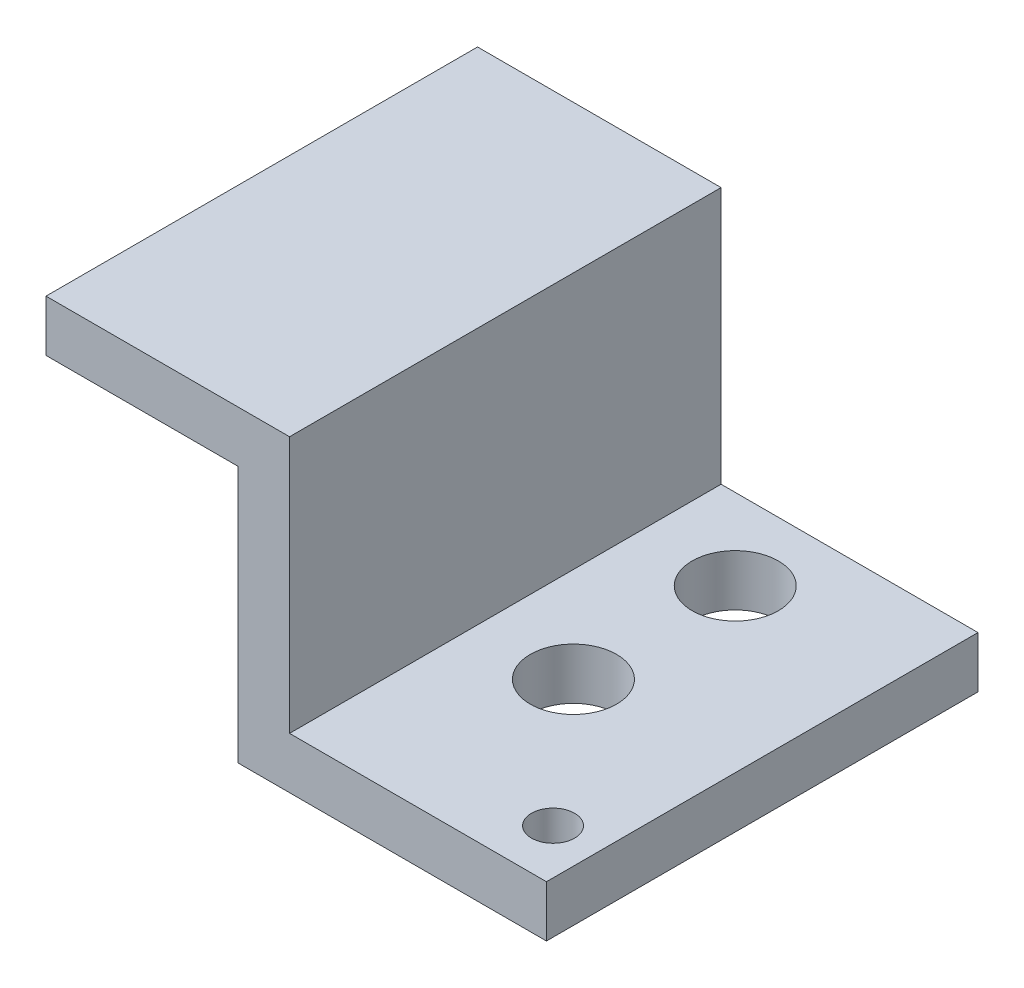
ISO-10303-21;
HEADER;
FILE_DESCRIPTION(('STEP AP214'),'2;1');
FILE_NAME('part.step','',(''),(''),'','','');
FILE_SCHEMA(('AUTOMOTIVE_DESIGN { 1 0 10303 214 1 1 1 1 }'));
ENDSEC;
DATA;
#1=APPLICATION_CONTEXT('core data for automotive mechanical design processes');
#2=APPLICATION_PROTOCOL_DEFINITION('international standard','automotive_design',2000,#1);
#3=PRODUCT_CONTEXT('',#1,'mechanical');
#4=PRODUCT('Part','Part','',(#3));
#5=PRODUCT_RELATED_PRODUCT_CATEGORY('part','',(#4));
#6=PRODUCT_DEFINITION_FORMATION('','',#4);
#7=PRODUCT_DEFINITION_CONTEXT('part definition',#1,'design');
#8=PRODUCT_DEFINITION('design','',#6,#7);
#9=PRODUCT_DEFINITION_SHAPE('','',#8);
#10=(LENGTH_UNIT() NAMED_UNIT(*) SI_UNIT(.MILLI.,.METRE.));
#11=(NAMED_UNIT(*) PLANE_ANGLE_UNIT() SI_UNIT($,.RADIAN.));
#12=(NAMED_UNIT(*) SI_UNIT($,.STERADIAN.) SOLID_ANGLE_UNIT());
#13=UNCERTAINTY_MEASURE_WITH_UNIT(LENGTH_MEASURE(1.E-05),#10,'distance_accuracy_value','');
#14=(GEOMETRIC_REPRESENTATION_CONTEXT(3) GLOBAL_UNCERTAINTY_ASSIGNED_CONTEXT((#13)) GLOBAL_UNIT_ASSIGNED_CONTEXT((#10,
#11,#12)) REPRESENTATION_CONTEXT('',''));
#15=CARTESIAN_POINT('',(0.,0.,0.));
#16=DIRECTION('',(0.,0.,1.));
#17=DIRECTION('',(1.,0.,0.));
#18=AXIS2_PLACEMENT_3D('',#15,#16,#17);
#19=CARTESIAN_POINT('',(2.38125,-9.525,40.));
#20=DIRECTION('',(0.,-1.,0.));
#21=DIRECTION('',(0.,0.,-1.));
#22=AXIS2_PLACEMENT_3D('',#19,#20,#21);
#23=PLANE('',#22);
#24=CARTESIAN_POINT('',(11.19375,-9.525,7.5));
#25=DIRECTION('',(0.,-1.,0.));
#26=DIRECTION('',(0.,0.,-1.));
#27=AXIS2_PLACEMENT_3D('',#24,#25,#26);
#28=CIRCLE('',#27,4.);
#29=CARTESIAN_POINT('',(11.19375,-9.525,3.5));
#30=VERTEX_POINT('',#29);
#31=EDGE_CURVE('E195',#30,#30,#28,.F.);
#32=ORIENTED_EDGE('',*,*,#31,.F.);
#33=EDGE_LOOP('',(#32));
#34=FACE_BOUND('',#33,.T.);
#35=CARTESIAN_POINT('',(11.19375,-9.525,22.5));
#36=DIRECTION('',(0.,-1.,0.));
#37=DIRECTION('',(0.,0.,-1.));
#38=AXIS2_PLACEMENT_3D('',#35,#36,#37);
#39=CIRCLE('',#38,4.);
#40=CARTESIAN_POINT('',(11.19375,-9.525,18.5));
#41=VERTEX_POINT('',#40);
#42=EDGE_CURVE('E211',#41,#41,#39,.F.);
#43=ORIENTED_EDGE('',*,*,#42,.F.);
#44=EDGE_LOOP('',(#43));
#45=FACE_BOUND('',#44,.T.);
#46=CARTESIAN_POINT('',(22.0033493,-9.525,35.1973816));
#47=DIRECTION('',(0.,-1.,0.));
#48=DIRECTION('',(0.,0.,-1.));
#49=AXIS2_PLACEMENT_3D('',#46,#47,#48);
#50=CIRCLE('',#49,2.);
#51=CARTESIAN_POINT('',(22.0033493,-9.525,33.1973816));
#52=VERTEX_POINT('',#51);
#53=EDGE_CURVE('E212',#52,#52,#50,.F.);
#54=ORIENTED_EDGE('',*,*,#53,.F.);
#55=EDGE_LOOP('',(#54));
#56=FACE_BOUND('',#55,.T.);
#57=DIRECTION('',(-1.,0.,0.));
#58=VECTOR('',#57,1.);
#59=CARTESIAN_POINT('',(2.38125,-9.525,0.));
#60=LINE('',#59,#58);
#61=CARTESIAN_POINT('',(26.19375,-9.525,0.));
#62=VERTEX_POINT('',#61);
#63=CARTESIAN_POINT('',(2.38125,-9.525,0.));
#64=VERTEX_POINT('',#63);
#65=EDGE_CURVE('E146',#62,#64,#60,.T.);
#66=ORIENTED_EDGE('',*,*,#65,.T.);
#67=DIRECTION('',(0.,0.,-1.));
#68=VECTOR('',#67,1.);
#69=CARTESIAN_POINT('',(2.38125,-9.525,40.));
#70=LINE('',#69,#68);
#71=CARTESIAN_POINT('',(2.38125,-9.525,40.));
#72=VERTEX_POINT('',#71);
#73=EDGE_CURVE('E11',#72,#64,#70,.T.);
#74=ORIENTED_EDGE('',*,*,#73,.F.);
#75=DIRECTION('',(-1.,0.,0.));
#76=VECTOR('',#75,1.);
#77=CARTESIAN_POINT('',(2.38125,-9.525,40.));
#78=LINE('',#77,#76);
#79=CARTESIAN_POINT('',(26.19375,-9.525,40.));
#80=VERTEX_POINT('',#79);
#81=EDGE_CURVE('E168',#80,#72,#78,.T.);
#82=ORIENTED_EDGE('',*,*,#81,.F.);
#83=DIRECTION('',(0.,0.,-1.));
#84=VECTOR('',#83,1.);
#85=CARTESIAN_POINT('',(26.19375,-9.525,40.));
#86=LINE('',#85,#84);
#87=EDGE_CURVE('E142',#80,#62,#86,.T.);
#88=ORIENTED_EDGE('',*,*,#87,.T.);
#89=EDGE_LOOP('',(#66,#74,#82,#88));
#90=FACE_BOUND('',#89,.T.);
#91=ADVANCED_FACE('F44',(#34,#45,#56,#90),#23,.F.);
#92=CARTESIAN_POINT('',(2.38125,-9.525,40.));
#93=DIRECTION('',(-1.,0.,0.));
#94=DIRECTION('',(0.,0.,1.));
#95=AXIS2_PLACEMENT_3D('',#92,#93,#94);
#96=PLANE('',#95);
#97=DIRECTION('',(0.,1.,0.));
#98=VECTOR('',#97,1.);
#99=CARTESIAN_POINT('',(2.38125,-9.525,0.));
#100=LINE('',#99,#98);
#101=CARTESIAN_POINT('',(2.38125,14.2875,0.));
#102=VERTEX_POINT('',#101);
#103=EDGE_CURVE('E150',#64,#102,#100,.T.);
#104=ORIENTED_EDGE('',*,*,#103,.T.);
#105=DIRECTION('',(0.,0.,-1.));
#106=VECTOR('',#105,1.);
#107=CARTESIAN_POINT('',(2.38125,14.2875,40.));
#108=LINE('',#107,#106);
#109=CARTESIAN_POINT('',(2.38125,14.2875,40.));
#110=VERTEX_POINT('',#109);
#111=EDGE_CURVE('E52',#110,#102,#108,.T.);
#112=ORIENTED_EDGE('',*,*,#111,.F.);
#113=DIRECTION('',(0.,1.,0.));
#114=VECTOR('',#113,1.);
#115=CARTESIAN_POINT('',(2.38125,-9.525,40.));
#116=LINE('',#115,#114);
#117=EDGE_CURVE('E103',#72,#110,#116,.T.);
#118=ORIENTED_EDGE('',*,*,#117,.F.);
#119=ORIENTED_EDGE('',*,*,#73,.T.);
#120=EDGE_LOOP('',(#104,#112,#118,#119));
#121=FACE_BOUND('',#120,.T.);
#122=ADVANCED_FACE('F255',(#121),#96,.F.);
#123=CARTESIAN_POINT('',(2.38125,14.2875,40.));
#124=DIRECTION('',(0.,-1.,0.));
#125=DIRECTION('',(0.,0.,-1.));
#126=AXIS2_PLACEMENT_3D('',#123,#124,#125);
#127=PLANE('',#126);
#128=DIRECTION('',(-1.,0.,0.));
#129=VECTOR('',#128,1.);
#130=CARTESIAN_POINT('',(2.38125,14.2875,0.));
#131=LINE('',#130,#129);
#132=CARTESIAN_POINT('',(-20.19375,14.2875,0.));
#133=VERTEX_POINT('',#132);
#134=EDGE_CURVE('E154',#102,#133,#131,.T.);
#135=ORIENTED_EDGE('',*,*,#134,.T.);
#136=DIRECTION('',(0.,0.,-1.));
#137=VECTOR('',#136,1.);
#138=CARTESIAN_POINT('',(-20.19375,14.2875,0.));
#139=LINE('',#138,#137);
#140=CARTESIAN_POINT('',(-20.19375,14.2875,40.));
#141=VERTEX_POINT('',#140);
#142=EDGE_CURVE('E59',#141,#133,#139,.T.);
#143=ORIENTED_EDGE('',*,*,#142,.F.);
#144=DIRECTION('',(-1.,0.,0.));
#145=VECTOR('',#144,1.);
#146=CARTESIAN_POINT('',(2.38125,14.2875,40.));
#147=LINE('',#146,#145);
#148=EDGE_CURVE('E180',#110,#141,#147,.T.);
#149=ORIENTED_EDGE('',*,*,#148,.F.);
#150=ORIENTED_EDGE('',*,*,#111,.T.);
#151=EDGE_LOOP('',(#135,#143,#149,#150));
#152=FACE_BOUND('',#151,.T.);
#153=ADVANCED_FACE('F179',(#152),#127,.F.);
#154=CARTESIAN_POINT('',(-2.38125,9.525,40.));
#155=DIRECTION('',(0.,1.,0.));
#156=DIRECTION('',(0.,0.,1.));
#157=AXIS2_PLACEMENT_3D('',#154,#155,#156);
#158=PLANE('',#157);
#159=DIRECTION('',(1.,0.,0.));
#160=VECTOR('',#159,1.);
#161=CARTESIAN_POINT('',(-2.38125,9.525,40.));
#162=LINE('',#161,#160);
#163=CARTESIAN_POINT('',(-20.19375,9.525,40.));
#164=VERTEX_POINT('',#163);
#165=CARTESIAN_POINT('',(-2.38125,9.525,40.));
#166=VERTEX_POINT('',#165);
#167=EDGE_CURVE('E121',#164,#166,#162,.T.);
#168=ORIENTED_EDGE('',*,*,#167,.F.);
#169=DIRECTION('',(0.,0.,1.));
#170=VECTOR('',#169,1.);
#171=CARTESIAN_POINT('',(-20.19375,9.525,0.));
#172=LINE('',#171,#170);
#173=CARTESIAN_POINT('',(-20.19375,9.525,0.));
#174=VERTEX_POINT('',#173);
#175=EDGE_CURVE('E151',#174,#164,#172,.T.);
#176=ORIENTED_EDGE('',*,*,#175,.F.);
#177=DIRECTION('',(1.,0.,0.));
#178=VECTOR('',#177,1.);
#179=CARTESIAN_POINT('',(-2.38125,9.525,0.));
#180=LINE('',#179,#178);
#181=CARTESIAN_POINT('',(-2.38125,9.525,0.));
#182=VERTEX_POINT('',#181);
#183=EDGE_CURVE('E158',#174,#182,#180,.T.);
#184=ORIENTED_EDGE('',*,*,#183,.T.);
#185=DIRECTION('',(0.,0.,-1.));
#186=VECTOR('',#185,1.);
#187=CARTESIAN_POINT('',(-2.38125,9.525,40.));
#188=LINE('',#187,#186);
#189=EDGE_CURVE('E135',#166,#182,#188,.T.);
#190=ORIENTED_EDGE('',*,*,#189,.F.);
#191=EDGE_LOOP('',(#168,#176,#184,#190));
#192=FACE_BOUND('',#191,.T.);
#193=ADVANCED_FACE('F272',(#192),#158,.F.);
#194=CARTESIAN_POINT('',(-2.38125,-14.2875,40.));
#195=DIRECTION('',(1.,0.,0.));
#196=DIRECTION('',(0.,0.,-1.));
#197=AXIS2_PLACEMENT_3D('',#194,#195,#196);
#198=PLANE('',#197);
#199=DIRECTION('',(0.,-1.,0.));
#200=VECTOR('',#199,1.);
#201=CARTESIAN_POINT('',(-2.38125,-14.2875,0.));
#202=LINE('',#201,#200);
#203=CARTESIAN_POINT('',(-2.38125,-14.2875,0.));
#204=VERTEX_POINT('',#203);
#205=EDGE_CURVE('E131',#182,#204,#202,.T.);
#206=ORIENTED_EDGE('',*,*,#205,.T.);
#207=DIRECTION('',(0.,0.,-1.));
#208=VECTOR('',#207,1.);
#209=CARTESIAN_POINT('',(-2.38125,-14.2875,40.));
#210=LINE('',#209,#208);
#211=CARTESIAN_POINT('',(-2.38125,-14.2875,40.));
#212=VERTEX_POINT('',#211);
#213=EDGE_CURVE('E128',#212,#204,#210,.T.);
#214=ORIENTED_EDGE('',*,*,#213,.F.);
#215=DIRECTION('',(0.,-1.,0.));
#216=VECTOR('',#215,1.);
#217=CARTESIAN_POINT('',(-2.38125,-14.2875,40.));
#218=LINE('',#217,#216);
#219=EDGE_CURVE('E112',#166,#212,#218,.T.);
#220=ORIENTED_EDGE('',*,*,#219,.F.);
#221=ORIENTED_EDGE('',*,*,#189,.T.);
#222=EDGE_LOOP('',(#206,#214,#220,#221));
#223=FACE_BOUND('',#222,.T.);
#224=ADVANCED_FACE('F129',(#223),#198,.F.);
#225=CARTESIAN_POINT('',(-2.38125,-14.2875,40.));
#226=DIRECTION('',(0.,1.,0.));
#227=DIRECTION('',(0.,0.,1.));
#228=AXIS2_PLACEMENT_3D('',#225,#226,#227);
#229=PLANE('',#228);
#230=CARTESIAN_POINT('',(11.19375,-14.2875,7.5));
#231=DIRECTION('',(0.,-1.,0.));
#232=DIRECTION('',(0.,0.,-1.));
#233=AXIS2_PLACEMENT_3D('',#230,#231,#232);
#234=CIRCLE('',#233,4.);
#235=CARTESIAN_POINT('',(11.19375,-14.2875,3.5));
#236=VERTEX_POINT('',#235);
#237=EDGE_CURVE('E220',#236,#236,#234,.T.);
#238=ORIENTED_EDGE('',*,*,#237,.F.);
#239=EDGE_LOOP('',(#238));
#240=FACE_BOUND('',#239,.T.);
#241=CARTESIAN_POINT('',(11.19375,-14.2875,22.5));
#242=DIRECTION('',(0.,-1.,0.));
#243=DIRECTION('',(0.,0.,-1.));
#244=AXIS2_PLACEMENT_3D('',#241,#242,#243);
#245=CIRCLE('',#244,4.);
#246=CARTESIAN_POINT('',(11.19375,-14.2875,18.5));
#247=VERTEX_POINT('',#246);
#248=EDGE_CURVE('E216',#247,#247,#245,.T.);
#249=ORIENTED_EDGE('',*,*,#248,.F.);
#250=EDGE_LOOP('',(#249));
#251=FACE_BOUND('',#250,.T.);
#252=CARTESIAN_POINT('',(22.0033493,-14.2875,35.1973816));
#253=DIRECTION('',(0.,-1.,0.));
#254=DIRECTION('',(0.,0.,-1.));
#255=AXIS2_PLACEMENT_3D('',#252,#253,#254);
#256=CIRCLE('',#255,2.);
#257=CARTESIAN_POINT('',(22.0033493,-14.2875,33.1973816));
#258=VERTEX_POINT('',#257);
#259=EDGE_CURVE('E207',#258,#258,#256,.T.);
#260=ORIENTED_EDGE('',*,*,#259,.F.);
#261=EDGE_LOOP('',(#260));
#262=FACE_BOUND('',#261,.T.);
#263=DIRECTION('',(1.,0.,0.));
#264=VECTOR('',#263,1.);
#265=CARTESIAN_POINT('',(-2.38125,-14.2875,0.));
#266=LINE('',#265,#264);
#267=CARTESIAN_POINT('',(26.19375,-14.2875,0.));
#268=VERTEX_POINT('',#267);
#269=EDGE_CURVE('E163',#204,#268,#266,.T.);
#270=ORIENTED_EDGE('',*,*,#269,.T.);
#271=DIRECTION('',(0.,0.,-1.));
#272=VECTOR('',#271,1.);
#273=CARTESIAN_POINT('',(26.19375,-14.2875,40.));
#274=LINE('',#273,#272);
#275=CARTESIAN_POINT('',(26.19375,-14.2875,40.));
#276=VERTEX_POINT('',#275);
#277=EDGE_CURVE('E136',#276,#268,#274,.T.);
#278=ORIENTED_EDGE('',*,*,#277,.F.);
#279=DIRECTION('',(1.,0.,0.));
#280=VECTOR('',#279,1.);
#281=CARTESIAN_POINT('',(-2.38125,-14.2875,40.));
#282=LINE('',#281,#280);
#283=EDGE_CURVE('E117',#212,#276,#282,.T.);
#284=ORIENTED_EDGE('',*,*,#283,.F.);
#285=ORIENTED_EDGE('',*,*,#213,.T.);
#286=EDGE_LOOP('',(#270,#278,#284,#285));
#287=FACE_BOUND('',#286,.T.);
#288=ADVANCED_FACE('F138',(#240,#251,#262,#287),#229,.F.);
#289=CARTESIAN_POINT('',(26.19375,-9.525,40.));
#290=DIRECTION('',(-1.,0.,0.));
#291=DIRECTION('',(0.,0.,1.));
#292=AXIS2_PLACEMENT_3D('',#289,#290,#291);
#293=PLANE('',#292);
#294=DIRECTION('',(0.,1.,0.));
#295=VECTOR('',#294,1.);
#296=CARTESIAN_POINT('',(26.19375,-9.525,0.));
#297=LINE('',#296,#295);
#298=EDGE_CURVE('E95',#268,#62,#297,.T.);
#299=ORIENTED_EDGE('',*,*,#298,.T.);
#300=ORIENTED_EDGE('',*,*,#87,.F.);
#301=DIRECTION('',(0.,1.,0.));
#302=VECTOR('',#301,1.);
#303=CARTESIAN_POINT('',(26.19375,-9.525,40.));
#304=LINE('',#303,#302);
#305=EDGE_CURVE('E68',#276,#80,#304,.T.);
#306=ORIENTED_EDGE('',*,*,#305,.F.);
#307=ORIENTED_EDGE('',*,*,#277,.T.);
#308=EDGE_LOOP('',(#299,#300,#306,#307));
#309=FACE_BOUND('',#308,.T.);
#310=ADVANCED_FACE('F235',(#309),#293,.F.);
#311=CARTESIAN_POINT('',(0.,0.,40.));
#312=DIRECTION('',(0.,0.,-1.));
#313=DIRECTION('',(-1.,0.,0.));
#314=AXIS2_PLACEMENT_3D('',#311,#312,#313);
#315=PLANE('',#314);
#316=ORIENTED_EDGE('',*,*,#148,.T.);
#317=DIRECTION('',(0.,1.,0.));
#318=VECTOR('',#317,1.);
#319=CARTESIAN_POINT('',(-20.19375,-30.9224968323134,40.));
#320=LINE('',#319,#318);
#321=EDGE_CURVE('E190',#164,#141,#320,.T.);
#322=ORIENTED_EDGE('',*,*,#321,.F.);
#323=ORIENTED_EDGE('',*,*,#167,.T.);
#324=ORIENTED_EDGE('',*,*,#219,.T.);
#325=ORIENTED_EDGE('',*,*,#283,.T.);
#326=ORIENTED_EDGE('',*,*,#305,.T.);
#327=ORIENTED_EDGE('',*,*,#81,.T.);
#328=ORIENTED_EDGE('',*,*,#117,.T.);
#329=EDGE_LOOP('',(#316,#322,#323,#324,#325,#326,#327,#328));
#330=FACE_BOUND('',#329,.T.);
#331=ADVANCED_FACE('F115',(#330),#315,.F.);
#332=CARTESIAN_POINT('',(0.,0.,0.));
#333=DIRECTION('',(0.,0.,-1.));
#334=DIRECTION('',(-1.,0.,0.));
#335=AXIS2_PLACEMENT_3D('',#332,#333,#334);
#336=PLANE('',#335);
#337=DIRECTION('',(0.,1.,0.));
#338=VECTOR('',#337,1.);
#339=CARTESIAN_POINT('',(-20.19375,-30.9224968323134,0.));
#340=LINE('',#339,#338);
#341=EDGE_CURVE('E185',#174,#133,#340,.T.);
#342=ORIENTED_EDGE('',*,*,#341,.T.);
#343=ORIENTED_EDGE('',*,*,#134,.F.);
#344=ORIENTED_EDGE('',*,*,#103,.F.);
#345=ORIENTED_EDGE('',*,*,#65,.F.);
#346=ORIENTED_EDGE('',*,*,#298,.F.);
#347=ORIENTED_EDGE('',*,*,#269,.F.);
#348=ORIENTED_EDGE('',*,*,#205,.F.);
#349=ORIENTED_EDGE('',*,*,#183,.F.);
#350=EDGE_LOOP('',(#342,#343,#344,#345,#346,#347,#348,#349));
#351=FACE_BOUND('',#350,.T.);
#352=ADVANCED_FACE('F182',(#351),#336,.T.);
#353=CARTESIAN_POINT('',(-20.19375,-30.9224968323134,0.));
#354=DIRECTION('',(1.,0.,0.));
#355=DIRECTION('',(0.,0.,-1.));
#356=AXIS2_PLACEMENT_3D('',#353,#354,#355);
#357=PLANE('',#356);
#358=ORIENTED_EDGE('',*,*,#175,.T.);
#359=ORIENTED_EDGE('',*,*,#321,.T.);
#360=ORIENTED_EDGE('',*,*,#142,.T.);
#361=ORIENTED_EDGE('',*,*,#341,.F.);
#362=EDGE_LOOP('',(#358,#359,#360,#361));
#363=FACE_BOUND('',#362,.T.);
#364=ADVANCED_FACE('F244',(#363),#357,.F.);
#365=CARTESIAN_POINT('',(22.0033493,1.78870849898476,35.1973816));
#366=DIRECTION('',(0.,-1.,0.));
#367=DIRECTION('',(0.,0.,-1.));
#368=AXIS2_PLACEMENT_3D('',#365,#366,#367);
#369=CYLINDRICAL_SURFACE('',#368,2.);
#370=ORIENTED_EDGE('',*,*,#53,.T.);
#371=EDGE_LOOP('',(#370));
#372=FACE_BOUND('',#371,.T.);
#373=ORIENTED_EDGE('',*,*,#259,.T.);
#374=EDGE_LOOP('',(#373));
#375=FACE_BOUND('',#374,.T.);
#376=ADVANCED_FACE('F241',(#372,#375),#369,.F.);
#377=CARTESIAN_POINT('',(11.19375,1.78870849898476,22.5));
#378=DIRECTION('',(0.,-1.,0.));
#379=DIRECTION('',(0.,0.,-1.));
#380=AXIS2_PLACEMENT_3D('',#377,#378,#379);
#381=CYLINDRICAL_SURFACE('',#380,4.);
#382=ORIENTED_EDGE('',*,*,#42,.T.);
#383=EDGE_LOOP('',(#382));
#384=FACE_BOUND('',#383,.T.);
#385=ORIENTED_EDGE('',*,*,#248,.T.);
#386=EDGE_LOOP('',(#385));
#387=FACE_BOUND('',#386,.T.);
#388=ADVANCED_FACE('F243',(#384,#387),#381,.F.);
#389=CARTESIAN_POINT('',(11.19375,1.78870849898476,7.5));
#390=DIRECTION('',(0.,-1.,0.));
#391=DIRECTION('',(0.,0.,-1.));
#392=AXIS2_PLACEMENT_3D('',#389,#390,#391);
#393=CYLINDRICAL_SURFACE('',#392,4.);
#394=ORIENTED_EDGE('',*,*,#31,.T.);
#395=EDGE_LOOP('',(#394));
#396=FACE_BOUND('',#395,.T.);
#397=ORIENTED_EDGE('',*,*,#237,.T.);
#398=EDGE_LOOP('',(#397));
#399=FACE_BOUND('',#398,.T.);
#400=ADVANCED_FACE('F231',(#396,#399),#393,.F.);
#401=CLOSED_SHELL('',(#91,#122,#153,#193,#224,#288,#310,#331,#352,#364,#376,#388,#400));
#402=MANIFOLD_SOLID_BREP('B2',#401);
#403=ADVANCED_BREP_SHAPE_REPRESENTATION('',(#18,#402),#14);
#404=SHAPE_DEFINITION_REPRESENTATION(#9,#403);
ENDSEC;
END-ISO-10303-21;
